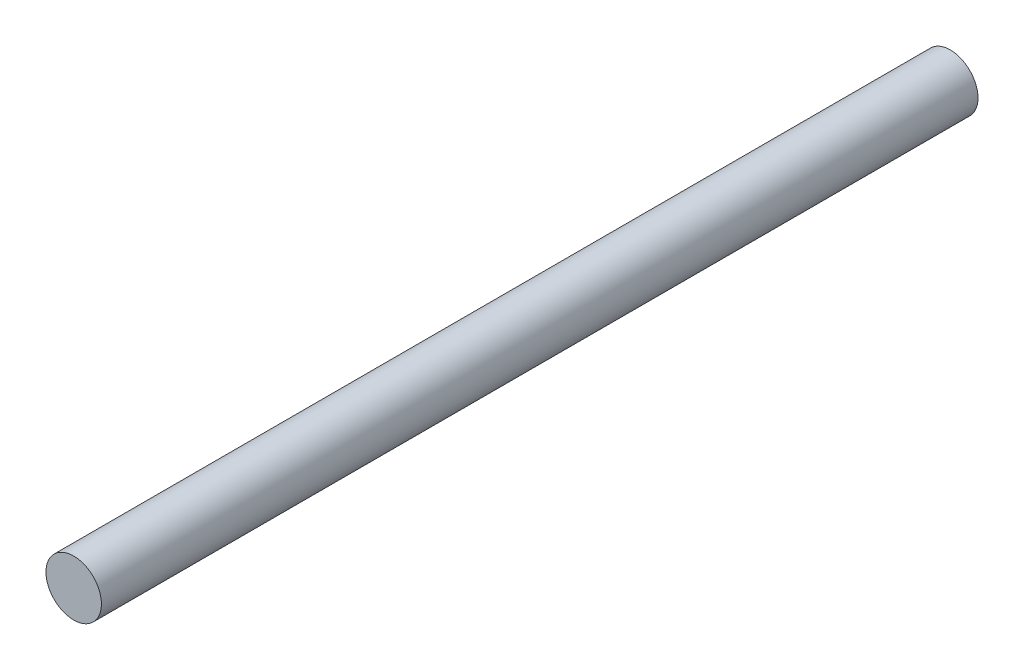
ISO-10303-21;
HEADER;
FILE_DESCRIPTION(('STEP AP214'),'2;1');
FILE_NAME('part.step','',(''),(''),'','','');
FILE_SCHEMA(('AUTOMOTIVE_DESIGN { 1 0 10303 214 1 1 1 1 }'));
ENDSEC;
DATA;
#1=APPLICATION_CONTEXT('core data for automotive mechanical design processes');
#2=APPLICATION_PROTOCOL_DEFINITION('international standard','automotive_design',2000,#1);
#3=PRODUCT_CONTEXT('',#1,'mechanical');
#4=PRODUCT('Part','Part','',(#3));
#5=PRODUCT_RELATED_PRODUCT_CATEGORY('part','',(#4));
#6=PRODUCT_DEFINITION_FORMATION('','',#4);
#7=PRODUCT_DEFINITION_CONTEXT('part definition',#1,'design');
#8=PRODUCT_DEFINITION('design','',#6,#7);
#9=PRODUCT_DEFINITION_SHAPE('','',#8);
#10=(LENGTH_UNIT() NAMED_UNIT(*) SI_UNIT(.MILLI.,.METRE.));
#11=(NAMED_UNIT(*) PLANE_ANGLE_UNIT() SI_UNIT($,.RADIAN.));
#12=(NAMED_UNIT(*) SI_UNIT($,.STERADIAN.) SOLID_ANGLE_UNIT());
#13=UNCERTAINTY_MEASURE_WITH_UNIT(LENGTH_MEASURE(1.E-05),#10,'distance_accuracy_value','');
#14=(GEOMETRIC_REPRESENTATION_CONTEXT(3) GLOBAL_UNCERTAINTY_ASSIGNED_CONTEXT((#13)) GLOBAL_UNIT_ASSIGNED_CONTEXT((#10,
#11,#12)) REPRESENTATION_CONTEXT('',''));
#15=CARTESIAN_POINT('',(0.,0.,0.));
#16=DIRECTION('',(0.,0.,1.));
#17=DIRECTION('',(1.,0.,0.));
#18=AXIS2_PLACEMENT_3D('',#15,#16,#17);
#19=CARTESIAN_POINT('',(0.,0.,100.33));
#20=DIRECTION('',(0.,0.,-1.));
#21=DIRECTION('',(-1.,0.,0.));
#22=AXIS2_PLACEMENT_3D('',#19,#20,#21);
#23=CYLINDRICAL_SURFACE('',#22,3.175);
#24=CARTESIAN_POINT('',(0.,0.,100.33));
#25=DIRECTION('',(0.,0.,1.));
#26=DIRECTION('',(1.,0.,0.));
#27=AXIS2_PLACEMENT_3D('',#24,#25,#26);
#28=CIRCLE('',#27,3.175);
#29=CARTESIAN_POINT('',(3.175,0.,100.33));
#30=VERTEX_POINT('',#29);
#31=EDGE_CURVE('E10',#30,#30,#28,.T.);
#32=ORIENTED_EDGE('',*,*,#31,.F.);
#33=EDGE_LOOP('',(#32));
#34=FACE_BOUND('',#33,.T.);
#35=CARTESIAN_POINT('',(0.,0.,0.));
#36=DIRECTION('',(0.,0.,1.));
#37=DIRECTION('',(1.,0.,0.));
#38=AXIS2_PLACEMENT_3D('',#35,#36,#37);
#39=CIRCLE('',#38,3.175);
#40=CARTESIAN_POINT('',(3.175,0.,0.));
#41=VERTEX_POINT('',#40);
#42=EDGE_CURVE('E40',#41,#41,#39,.T.);
#43=ORIENTED_EDGE('',*,*,#42,.T.);
#44=EDGE_LOOP('',(#43));
#45=FACE_BOUND('',#44,.T.);
#46=ADVANCED_FACE('F37',(#34,#45),#23,.T.);
#47=CARTESIAN_POINT('',(0.,0.,100.33));
#48=DIRECTION('',(0.,0.,1.));
#49=DIRECTION('',(1.,0.,0.));
#50=AXIS2_PLACEMENT_3D('',#47,#48,#49);
#51=PLANE('',#50);
#52=ORIENTED_EDGE('',*,*,#31,.T.);
#53=EDGE_LOOP('',(#52));
#54=FACE_BOUND('',#53,.T.);
#55=ADVANCED_FACE('F54',(#54),#51,.T.);
#56=CARTESIAN_POINT('',(0.,0.,0.));
#57=DIRECTION('',(0.,0.,1.));
#58=DIRECTION('',(1.,0.,0.));
#59=AXIS2_PLACEMENT_3D('',#56,#57,#58);
#60=PLANE('',#59);
#61=ORIENTED_EDGE('',*,*,#42,.F.);
#62=EDGE_LOOP('',(#61));
#63=FACE_BOUND('',#62,.T.);
#64=ADVANCED_FACE('F52',(#63),#60,.F.);
#65=CLOSED_SHELL('',(#46,#55,#64));
#66=MANIFOLD_SOLID_BREP('B2',#65);
#67=ADVANCED_BREP_SHAPE_REPRESENTATION('',(#18,#66),#14);
#68=SHAPE_DEFINITION_REPRESENTATION(#9,#67);
ENDSEC;
END-ISO-10303-21;
